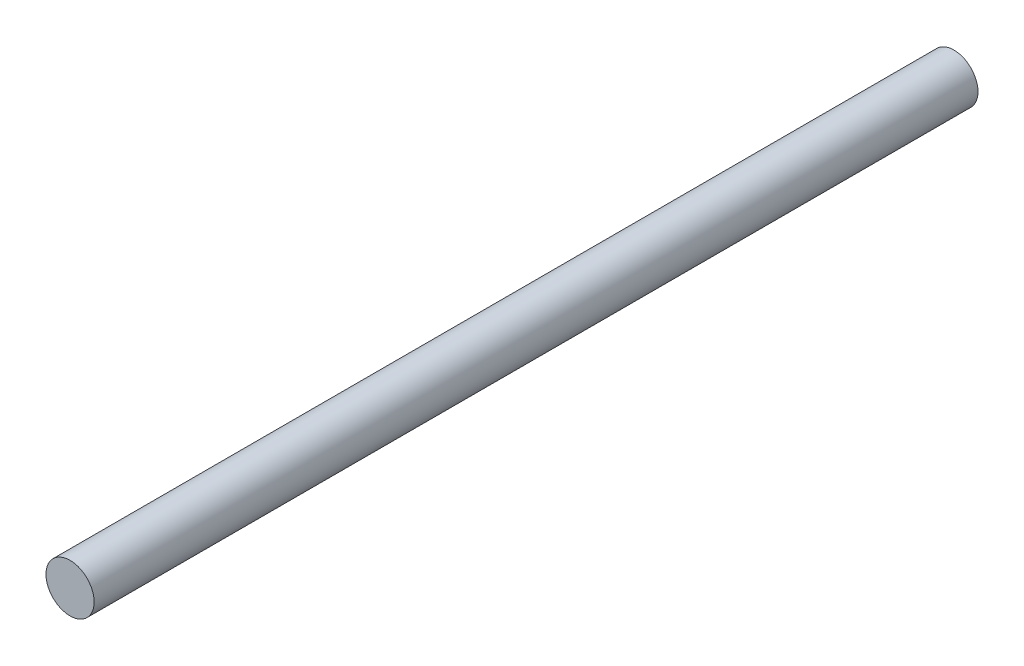
ISO-10303-21;
HEADER;
FILE_DESCRIPTION(('STEP AP214'),'2;1');
FILE_NAME('part.step','',(''),(''),'','','');
FILE_SCHEMA(('AUTOMOTIVE_DESIGN { 1 0 10303 214 1 1 1 1 }'));
ENDSEC;
DATA;
#1=APPLICATION_CONTEXT('core data for automotive mechanical design processes');
#2=APPLICATION_PROTOCOL_DEFINITION('international standard','automotive_design',2000,#1);
#3=PRODUCT_CONTEXT('',#1,'mechanical');
#4=PRODUCT('Part','Part','',(#3));
#5=PRODUCT_RELATED_PRODUCT_CATEGORY('part','',(#4));
#6=PRODUCT_DEFINITION_FORMATION('','',#4);
#7=PRODUCT_DEFINITION_CONTEXT('part definition',#1,'design');
#8=PRODUCT_DEFINITION('design','',#6,#7);
#9=PRODUCT_DEFINITION_SHAPE('','',#8);
#10=(LENGTH_UNIT() NAMED_UNIT(*) SI_UNIT(.MILLI.,.METRE.));
#11=(NAMED_UNIT(*) PLANE_ANGLE_UNIT() SI_UNIT($,.RADIAN.));
#12=(NAMED_UNIT(*) SI_UNIT($,.STERADIAN.) SOLID_ANGLE_UNIT());
#13=UNCERTAINTY_MEASURE_WITH_UNIT(LENGTH_MEASURE(1.E-05),#10,'distance_accuracy_value','');
#14=(GEOMETRIC_REPRESENTATION_CONTEXT(3) GLOBAL_UNCERTAINTY_ASSIGNED_CONTEXT((#13)) GLOBAL_UNIT_ASSIGNED_CONTEXT((#10,
#11,#12)) REPRESENTATION_CONTEXT('',''));
#15=CARTESIAN_POINT('',(0.,0.,0.));
#16=DIRECTION('',(0.,0.,1.));
#17=DIRECTION('',(1.,0.,0.));
#18=AXIS2_PLACEMENT_3D('',#15,#16,#17);
#19=CARTESIAN_POINT('',(0.,0.,50.8));
#20=DIRECTION('',(0.,0.,-1.));
#21=DIRECTION('',(-1.,0.,0.));
#22=AXIS2_PLACEMENT_3D('',#19,#20,#21);
#23=CYLINDRICAL_SURFACE('',#22,1.3843);
#24=CARTESIAN_POINT('',(0.,0.,50.8));
#25=DIRECTION('',(0.,0.,1.));
#26=DIRECTION('',(1.,0.,0.));
#27=AXIS2_PLACEMENT_3D('',#24,#25,#26);
#28=CIRCLE('',#27,1.3843);
#29=CARTESIAN_POINT('',(1.3843,0.,50.8));
#30=VERTEX_POINT('',#29);
#31=EDGE_CURVE('E10',#30,#30,#28,.T.);
#32=ORIENTED_EDGE('',*,*,#31,.F.);
#33=EDGE_LOOP('',(#32));
#34=FACE_BOUND('',#33,.T.);
#35=CARTESIAN_POINT('',(0.,0.,0.));
#36=DIRECTION('',(0.,0.,1.));
#37=DIRECTION('',(1.,0.,0.));
#38=AXIS2_PLACEMENT_3D('',#35,#36,#37);
#39=CIRCLE('',#38,1.3843);
#40=CARTESIAN_POINT('',(1.3843,0.,0.));
#41=VERTEX_POINT('',#40);
#42=EDGE_CURVE('E44',#41,#41,#39,.T.);
#43=ORIENTED_EDGE('',*,*,#42,.T.);
#44=EDGE_LOOP('',(#43));
#45=FACE_BOUND('',#44,.T.);
#46=ADVANCED_FACE('F41',(#34,#45),#23,.T.);
#47=CARTESIAN_POINT('',(0.,0.,50.8));
#48=DIRECTION('',(0.,0.,1.));
#49=DIRECTION('',(1.,0.,0.));
#50=AXIS2_PLACEMENT_3D('',#47,#48,#49);
#51=PLANE('',#50);
#52=ORIENTED_EDGE('',*,*,#31,.T.);
#53=EDGE_LOOP('',(#52));
#54=FACE_BOUND('',#53,.T.);
#55=ADVANCED_FACE('F56',(#54),#51,.T.);
#56=CARTESIAN_POINT('',(0.,0.,0.));
#57=DIRECTION('',(0.,0.,1.));
#58=DIRECTION('',(1.,0.,0.));
#59=AXIS2_PLACEMENT_3D('',#56,#57,#58);
#60=PLANE('',#59);
#61=ORIENTED_EDGE('',*,*,#42,.F.);
#62=EDGE_LOOP('',(#61));
#63=FACE_BOUND('',#62,.T.);
#64=ADVANCED_FACE('F54',(#63),#60,.F.);
#65=CLOSED_SHELL('',(#46,#55,#64));
#66=MANIFOLD_SOLID_BREP('B2',#65);
#67=ADVANCED_BREP_SHAPE_REPRESENTATION('',(#18,#66),#14);
#68=SHAPE_DEFINITION_REPRESENTATION(#9,#67);
ENDSEC;
END-ISO-10303-21;
